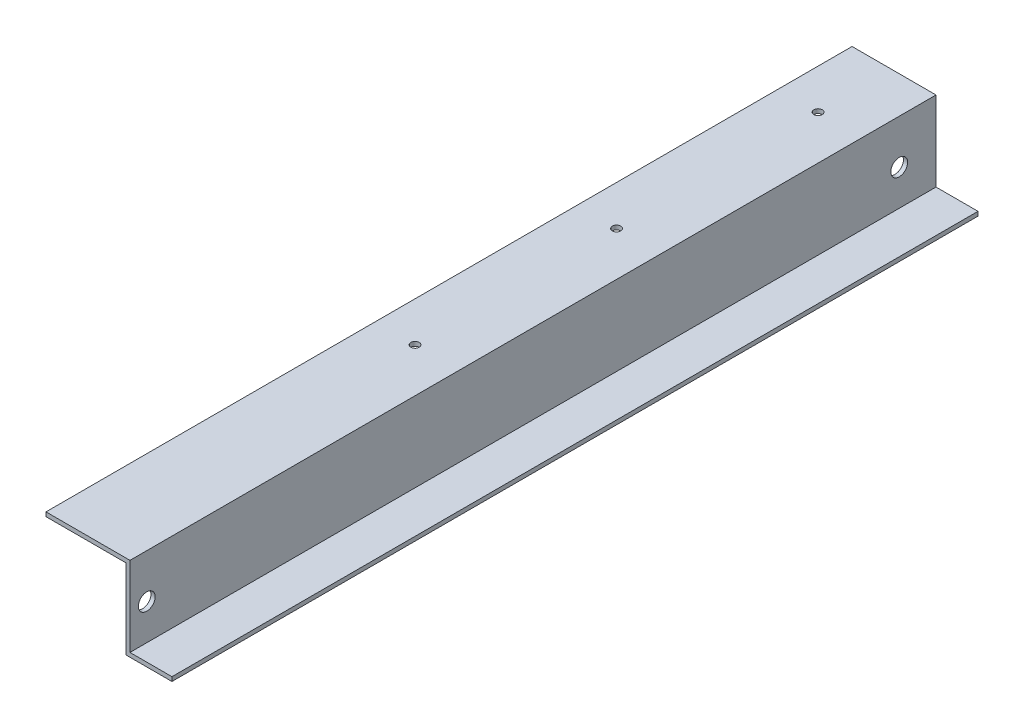
ISO-10303-21;
HEADER;
FILE_DESCRIPTION(('STEP AP214'),'2;1');
FILE_NAME('part.step','',(''),(''),'','','');
FILE_SCHEMA(('AUTOMOTIVE_DESIGN { 1 0 10303 214 1 1 1 1 }'));
ENDSEC;
DATA;
#1=APPLICATION_CONTEXT('core data for automotive mechanical design processes');
#2=APPLICATION_PROTOCOL_DEFINITION('international standard','automotive_design',2000,#1);
#3=PRODUCT_CONTEXT('',#1,'mechanical');
#4=PRODUCT('Part','Part','',(#3));
#5=PRODUCT_RELATED_PRODUCT_CATEGORY('part','',(#4));
#6=PRODUCT_DEFINITION_FORMATION('','',#4);
#7=PRODUCT_DEFINITION_CONTEXT('part definition',#1,'design');
#8=PRODUCT_DEFINITION('design','',#6,#7);
#9=PRODUCT_DEFINITION_SHAPE('','',#8);
#10=(LENGTH_UNIT() NAMED_UNIT(*) SI_UNIT(.MILLI.,.METRE.));
#11=(NAMED_UNIT(*) PLANE_ANGLE_UNIT() SI_UNIT($,.RADIAN.));
#12=(NAMED_UNIT(*) SI_UNIT($,.STERADIAN.) SOLID_ANGLE_UNIT());
#13=UNCERTAINTY_MEASURE_WITH_UNIT(LENGTH_MEASURE(1.E-05),#10,'distance_accuracy_value','');
#14=(GEOMETRIC_REPRESENTATION_CONTEXT(3) GLOBAL_UNCERTAINTY_ASSIGNED_CONTEXT((#13)) GLOBAL_UNIT_ASSIGNED_CONTEXT((#10,
#11,#12)) REPRESENTATION_CONTEXT('',''));
#15=CARTESIAN_POINT('',(0.,0.,0.));
#16=DIRECTION('',(0.,0.,1.));
#17=DIRECTION('',(1.,0.,0.));
#18=AXIS2_PLACEMENT_3D('',#15,#16,#17);
#19=CARTESIAN_POINT('',(0.79375,-14.2875,152.4));
#20=DIRECTION('',(0.,-1.,0.));
#21=DIRECTION('',(0.,0.,-1.));
#22=AXIS2_PLACEMENT_3D('',#19,#20,#21);
#23=PLANE('',#22);
#24=DIRECTION('',(0.,0.,-1.));
#25=VECTOR('',#24,1.);
#26=CARTESIAN_POINT('',(16.66875,-14.2875,152.4));
#27=LINE('',#26,#25);
#28=CARTESIAN_POINT('',(16.66875,-14.2875,152.4));
#29=VERTEX_POINT('',#28);
#30=CARTESIAN_POINT('',(16.66875,-14.2875,-152.4));
#31=VERTEX_POINT('',#30);
#32=EDGE_CURVE('E124',#29,#31,#27,.T.);
#33=ORIENTED_EDGE('',*,*,#32,.T.);
#34=DIRECTION('',(-1.,0.,0.));
#35=VECTOR('',#34,1.);
#36=CARTESIAN_POINT('',(0.79375,-14.2875,-152.4));
#37=LINE('',#36,#35);
#38=CARTESIAN_POINT('',(0.79375,-14.2875,-152.4));
#39=VERTEX_POINT('',#38);
#40=EDGE_CURVE('E118',#31,#39,#37,.T.);
#41=ORIENTED_EDGE('',*,*,#40,.T.);
#42=DIRECTION('',(0.,0.,-1.));
#43=VECTOR('',#42,1.);
#44=CARTESIAN_POINT('',(0.79375,-14.2875,152.4));
#45=LINE('',#44,#43);
#46=CARTESIAN_POINT('',(0.79375,-14.2875,152.4));
#47=VERTEX_POINT('',#46);
#48=EDGE_CURVE('E11',#47,#39,#45,.T.);
#49=ORIENTED_EDGE('',*,*,#48,.F.);
#50=DIRECTION('',(-1.,0.,0.));
#51=VECTOR('',#50,1.);
#52=CARTESIAN_POINT('',(0.79375,-14.2875,152.4));
#53=LINE('',#52,#51);
#54=EDGE_CURVE('E149',#29,#47,#53,.T.);
#55=ORIENTED_EDGE('',*,*,#54,.F.);
#56=EDGE_LOOP('',(#33,#41,#49,#55));
#57=FACE_BOUND('',#56,.T.);
#58=ADVANCED_FACE('F42',(#57),#23,.F.);
#59=CARTESIAN_POINT('',(0.79375,-14.2875,152.4));
#60=DIRECTION('',(-1.,0.,0.));
#61=DIRECTION('',(0.,0.,1.));
#62=AXIS2_PLACEMENT_3D('',#59,#60,#61);
#63=PLANE('',#62);
#64=CARTESIAN_POINT('',(0.79375,-0.793749999999999,-138.4808));
#65=DIRECTION('',(-1.,0.,0.));
#66=DIRECTION('',(0.,0.,1.));
#67=AXIS2_PLACEMENT_3D('',#64,#65,#66);
#68=CIRCLE('',#67,3.175);
#69=CARTESIAN_POINT('',(0.79375,-0.793749999999999,-135.3058));
#70=VERTEX_POINT('',#69);
#71=EDGE_CURVE('E236',#70,#70,#68,.T.);
#72=ORIENTED_EDGE('',*,*,#71,.T.);
#73=EDGE_LOOP('',(#72));
#74=FACE_BOUND('',#73,.T.);
#75=CARTESIAN_POINT('',(0.79375,-0.793749999999999,146.05));
#76=DIRECTION('',(-1.,0.,0.));
#77=DIRECTION('',(0.,0.,1.));
#78=AXIS2_PLACEMENT_3D('',#75,#76,#77);
#79=CIRCLE('',#78,3.175);
#80=CARTESIAN_POINT('',(0.79375,-0.793749999999999,149.225));
#81=VERTEX_POINT('',#80);
#82=EDGE_CURVE('E234',#81,#81,#79,.T.);
#83=ORIENTED_EDGE('',*,*,#82,.T.);
#84=EDGE_LOOP('',(#83));
#85=FACE_BOUND('',#84,.T.);
#86=ORIENTED_EDGE('',*,*,#48,.T.);
#87=DIRECTION('',(0.,1.,0.));
#88=VECTOR('',#87,1.);
#89=CARTESIAN_POINT('',(0.79375,-14.2875,-152.4));
#90=LINE('',#89,#88);
#91=CARTESIAN_POINT('',(0.79375,15.875,-152.4));
#92=VERTEX_POINT('',#91);
#93=EDGE_CURVE('E108',#39,#92,#90,.T.);
#94=ORIENTED_EDGE('',*,*,#93,.T.);
#95=DIRECTION('',(0.,0.,-1.));
#96=VECTOR('',#95,1.);
#97=CARTESIAN_POINT('',(0.79375,15.875,152.4));
#98=LINE('',#97,#96);
#99=CARTESIAN_POINT('',(0.79375,15.875,152.4));
#100=VERTEX_POINT('',#99);
#101=EDGE_CURVE('E49',#100,#92,#98,.T.);
#102=ORIENTED_EDGE('',*,*,#101,.F.);
#103=DIRECTION('',(0.,1.,0.));
#104=VECTOR('',#103,1.);
#105=CARTESIAN_POINT('',(0.79375,-14.2875,152.4));
#106=LINE('',#105,#104);
#107=EDGE_CURVE('E109',#47,#100,#106,.T.);
#108=ORIENTED_EDGE('',*,*,#107,.F.);
#109=EDGE_LOOP('',(#86,#94,#102,#108));
#110=FACE_BOUND('',#109,.T.);
#111=ADVANCED_FACE('F106',(#74,#85,#110),#63,.F.);
#112=CARTESIAN_POINT('',(0.79375,15.875,152.4));
#113=DIRECTION('',(0.,-1.,0.));
#114=DIRECTION('',(0.,0.,-1.));
#115=AXIS2_PLACEMENT_3D('',#112,#113,#114);
#116=PLANE('',#115);
#117=CARTESIAN_POINT('',(-15.875,15.875,-124.46));
#118=DIRECTION('',(0.,-1.,0.));
#119=DIRECTION('',(0.,0.,-1.));
#120=AXIS2_PLACEMENT_3D('',#117,#118,#119);
#121=CIRCLE('',#120,1.5875);
#122=CARTESIAN_POINT('',(-15.875,15.875,-126.0475));
#123=VERTEX_POINT('',#122);
#124=EDGE_CURVE('E125',#123,#123,#121,.T.);
#125=ORIENTED_EDGE('',*,*,#124,.T.);
#126=EDGE_LOOP('',(#125));
#127=FACE_BOUND('',#126,.T.);
#128=CARTESIAN_POINT('',(-15.875,15.875,-48.2599999999999));
#129=DIRECTION('',(0.,-1.,0.));
#130=DIRECTION('',(0.,0.,-1.));
#131=AXIS2_PLACEMENT_3D('',#128,#129,#130);
#132=CIRCLE('',#131,1.5875);
#133=CARTESIAN_POINT('',(-15.875,15.875,-49.8474999999999));
#134=VERTEX_POINT('',#133);
#135=EDGE_CURVE('E247',#134,#134,#132,.T.);
#136=ORIENTED_EDGE('',*,*,#135,.T.);
#137=EDGE_LOOP('',(#136));
#138=FACE_BOUND('',#137,.T.);
#139=CARTESIAN_POINT('',(-15.875,15.875,27.9400000000001));
#140=DIRECTION('',(0.,-1.,0.));
#141=DIRECTION('',(0.,0.,-1.));
#142=AXIS2_PLACEMENT_3D('',#139,#140,#141);
#143=CIRCLE('',#142,1.5875);
#144=CARTESIAN_POINT('',(-15.875,15.875,26.3525000000001));
#145=VERTEX_POINT('',#144);
#146=EDGE_CURVE('E131',#145,#145,#143,.T.);
#147=ORIENTED_EDGE('',*,*,#146,.T.);
#148=EDGE_LOOP('',(#147));
#149=FACE_BOUND('',#148,.T.);
#150=ORIENTED_EDGE('',*,*,#101,.T.);
#151=DIRECTION('',(-1.,0.,0.));
#152=VECTOR('',#151,1.);
#153=CARTESIAN_POINT('',(0.79375,15.875,-152.4));
#154=LINE('',#153,#152);
#155=CARTESIAN_POINT('',(-30.95625,15.875,-152.4));
#156=VERTEX_POINT('',#155);
#157=EDGE_CURVE('E122',#92,#156,#154,.T.);
#158=ORIENTED_EDGE('',*,*,#157,.T.);
#159=DIRECTION('',(0.,0.,-1.));
#160=VECTOR('',#159,1.);
#161=CARTESIAN_POINT('',(-30.95625,15.875,152.4));
#162=LINE('',#161,#160);
#163=CARTESIAN_POINT('',(-30.95625,15.875,152.4));
#164=VERTEX_POINT('',#163);
#165=EDGE_CURVE('E171',#164,#156,#162,.T.);
#166=ORIENTED_EDGE('',*,*,#165,.F.);
#167=DIRECTION('',(-1.,0.,0.));
#168=VECTOR('',#167,1.);
#169=CARTESIAN_POINT('',(0.79375,15.875,152.4));
#170=LINE('',#169,#168);
#171=EDGE_CURVE('E152',#100,#164,#170,.T.);
#172=ORIENTED_EDGE('',*,*,#171,.F.);
#173=EDGE_LOOP('',(#150,#158,#166,#172));
#174=FACE_BOUND('',#173,.T.);
#175=ADVANCED_FACE('F174',(#127,#138,#149,#174),#116,.F.);
#176=CARTESIAN_POINT('',(-30.95625,15.875,152.4));
#177=DIRECTION('',(1.,0.,0.));
#178=DIRECTION('',(0.,0.,-1.));
#179=AXIS2_PLACEMENT_3D('',#176,#177,#178);
#180=PLANE('',#179);
#181=ORIENTED_EDGE('',*,*,#165,.T.);
#182=DIRECTION('',(0.,-1.,0.));
#183=VECTOR('',#182,1.);
#184=CARTESIAN_POINT('',(-30.95625,15.875,-152.4));
#185=LINE('',#184,#183);
#186=CARTESIAN_POINT('',(-30.95625,14.2875,-152.4));
#187=VERTEX_POINT('',#186);
#188=EDGE_CURVE('E135',#156,#187,#185,.T.);
#189=ORIENTED_EDGE('',*,*,#188,.T.);
#190=DIRECTION('',(0.,0.,-1.));
#191=VECTOR('',#190,1.);
#192=CARTESIAN_POINT('',(-30.95625,14.2875,152.4));
#193=LINE('',#192,#191);
#194=CARTESIAN_POINT('',(-30.95625,14.2875,152.4));
#195=VERTEX_POINT('',#194);
#196=EDGE_CURVE('E169',#195,#187,#193,.T.);
#197=ORIENTED_EDGE('',*,*,#196,.F.);
#198=DIRECTION('',(0.,-1.,0.));
#199=VECTOR('',#198,1.);
#200=CARTESIAN_POINT('',(-30.95625,15.875,152.4));
#201=LINE('',#200,#199);
#202=EDGE_CURVE('E154',#164,#195,#201,.T.);
#203=ORIENTED_EDGE('',*,*,#202,.F.);
#204=EDGE_LOOP('',(#181,#189,#197,#203));
#205=FACE_BOUND('',#204,.T.);
#206=ADVANCED_FACE('F182',(#205),#180,.F.);
#207=CARTESIAN_POINT('',(-0.79375,14.2875,152.4));
#208=DIRECTION('',(0.,1.,0.));
#209=DIRECTION('',(0.,0.,1.));
#210=AXIS2_PLACEMENT_3D('',#207,#208,#209);
#211=PLANE('',#210);
#212=CARTESIAN_POINT('',(-15.875,14.2875,-124.46));
#213=DIRECTION('',(0.,-1.,0.));
#214=DIRECTION('',(0.,0.,-1.));
#215=AXIS2_PLACEMENT_3D('',#212,#213,#214);
#216=CIRCLE('',#215,1.5875);
#217=CARTESIAN_POINT('',(-15.875,14.2875,-126.0475));
#218=VERTEX_POINT('',#217);
#219=EDGE_CURVE('E128',#218,#218,#216,.T.);
#220=ORIENTED_EDGE('',*,*,#219,.F.);
#221=EDGE_LOOP('',(#220));
#222=FACE_BOUND('',#221,.T.);
#223=CARTESIAN_POINT('',(-15.875,14.2875,-48.2599999999999));
#224=DIRECTION('',(0.,-1.,0.));
#225=DIRECTION('',(0.,0.,-1.));
#226=AXIS2_PLACEMENT_3D('',#223,#224,#225);
#227=CIRCLE('',#226,1.5875);
#228=CARTESIAN_POINT('',(-15.875,14.2875,-49.8474999999999));
#229=VERTEX_POINT('',#228);
#230=EDGE_CURVE('E244',#229,#229,#227,.T.);
#231=ORIENTED_EDGE('',*,*,#230,.F.);
#232=EDGE_LOOP('',(#231));
#233=FACE_BOUND('',#232,.T.);
#234=CARTESIAN_POINT('',(-15.875,14.2875,27.9400000000001));
#235=DIRECTION('',(0.,-1.,0.));
#236=DIRECTION('',(0.,0.,-1.));
#237=AXIS2_PLACEMENT_3D('',#234,#235,#236);
#238=CIRCLE('',#237,1.5875);
#239=CARTESIAN_POINT('',(-15.875,14.2875,26.3525000000001));
#240=VERTEX_POINT('',#239);
#241=EDGE_CURVE('E249',#240,#240,#238,.T.);
#242=ORIENTED_EDGE('',*,*,#241,.F.);
#243=EDGE_LOOP('',(#242));
#244=FACE_BOUND('',#243,.T.);
#245=ORIENTED_EDGE('',*,*,#196,.T.);
#246=DIRECTION('',(1.,0.,0.));
#247=VECTOR('',#246,1.);
#248=CARTESIAN_POINT('',(-0.79375,14.2875,-152.4));
#249=LINE('',#248,#247);
#250=CARTESIAN_POINT('',(-0.79375,14.2875,-152.4));
#251=VERTEX_POINT('',#250);
#252=EDGE_CURVE('E138',#187,#251,#249,.T.);
#253=ORIENTED_EDGE('',*,*,#252,.T.);
#254=DIRECTION('',(0.,0.,-1.));
#255=VECTOR('',#254,1.);
#256=CARTESIAN_POINT('',(-0.79375,14.2875,152.4));
#257=LINE('',#256,#255);
#258=CARTESIAN_POINT('',(-0.79375,14.2875,152.4));
#259=VERTEX_POINT('',#258);
#260=EDGE_CURVE('E167',#259,#251,#257,.T.);
#261=ORIENTED_EDGE('',*,*,#260,.F.);
#262=DIRECTION('',(1.,0.,0.));
#263=VECTOR('',#262,1.);
#264=CARTESIAN_POINT('',(-0.79375,14.2875,152.4));
#265=LINE('',#264,#263);
#266=EDGE_CURVE('E156',#195,#259,#265,.T.);
#267=ORIENTED_EDGE('',*,*,#266,.F.);
#268=EDGE_LOOP('',(#245,#253,#261,#267));
#269=FACE_BOUND('',#268,.T.);
#270=ADVANCED_FACE('F185',(#222,#233,#244,#269),#211,.F.);
#271=CARTESIAN_POINT('',(-0.79375,-15.875,152.4));
#272=DIRECTION('',(1.,0.,0.));
#273=DIRECTION('',(0.,0.,-1.));
#274=AXIS2_PLACEMENT_3D('',#271,#272,#273);
#275=PLANE('',#274);
#276=CARTESIAN_POINT('',(-0.79375,-0.793749999999999,-138.4808));
#277=DIRECTION('',(-1.,0.,0.));
#278=DIRECTION('',(0.,0.,1.));
#279=AXIS2_PLACEMENT_3D('',#276,#277,#278);
#280=CIRCLE('',#279,3.175);
#281=CARTESIAN_POINT('',(-0.79375,-0.793749999999999,-135.3058));
#282=VERTEX_POINT('',#281);
#283=EDGE_CURVE('E229',#282,#282,#280,.T.);
#284=ORIENTED_EDGE('',*,*,#283,.F.);
#285=EDGE_LOOP('',(#284));
#286=FACE_BOUND('',#285,.T.);
#287=CARTESIAN_POINT('',(-0.79375,-0.793749999999999,146.05));
#288=DIRECTION('',(-1.,0.,0.));
#289=DIRECTION('',(0.,0.,1.));
#290=AXIS2_PLACEMENT_3D('',#287,#288,#289);
#291=CIRCLE('',#290,3.175);
#292=CARTESIAN_POINT('',(-0.79375,-0.793749999999999,149.225));
#293=VERTEX_POINT('',#292);
#294=EDGE_CURVE('E232',#293,#293,#291,.T.);
#295=ORIENTED_EDGE('',*,*,#294,.F.);
#296=EDGE_LOOP('',(#295));
#297=FACE_BOUND('',#296,.T.);
#298=ORIENTED_EDGE('',*,*,#260,.T.);
#299=DIRECTION('',(0.,-1.,0.));
#300=VECTOR('',#299,1.);
#301=CARTESIAN_POINT('',(-0.79375,-15.875,-152.4));
#302=LINE('',#301,#300);
#303=CARTESIAN_POINT('',(-0.79375,-15.875,-152.4));
#304=VERTEX_POINT('',#303);
#305=EDGE_CURVE('E141',#251,#304,#302,.T.);
#306=ORIENTED_EDGE('',*,*,#305,.T.);
#307=DIRECTION('',(0.,0.,-1.));
#308=VECTOR('',#307,1.);
#309=CARTESIAN_POINT('',(-0.79375,-15.875,152.4));
#310=LINE('',#309,#308);
#311=CARTESIAN_POINT('',(-0.79375,-15.875,152.4));
#312=VERTEX_POINT('',#311);
#313=EDGE_CURVE('E165',#312,#304,#310,.T.);
#314=ORIENTED_EDGE('',*,*,#313,.F.);
#315=DIRECTION('',(0.,-1.,0.));
#316=VECTOR('',#315,1.);
#317=CARTESIAN_POINT('',(-0.79375,-15.875,152.4));
#318=LINE('',#317,#316);
#319=EDGE_CURVE('E158',#259,#312,#318,.T.);
#320=ORIENTED_EDGE('',*,*,#319,.F.);
#321=EDGE_LOOP('',(#298,#306,#314,#320));
#322=FACE_BOUND('',#321,.T.);
#323=ADVANCED_FACE('F190',(#286,#297,#322),#275,.F.);
#324=CARTESIAN_POINT('',(-0.79375,-15.875,152.4));
#325=DIRECTION('',(0.,1.,0.));
#326=DIRECTION('',(0.,0.,1.));
#327=AXIS2_PLACEMENT_3D('',#324,#325,#326);
#328=PLANE('',#327);
#329=ORIENTED_EDGE('',*,*,#313,.T.);
#330=DIRECTION('',(1.,0.,0.));
#331=VECTOR('',#330,1.);
#332=CARTESIAN_POINT('',(-0.79375,-15.875,-152.4));
#333=LINE('',#332,#331);
#334=CARTESIAN_POINT('',(16.66875,-15.875,-152.4));
#335=VERTEX_POINT('',#334);
#336=EDGE_CURVE('E144',#304,#335,#333,.T.);
#337=ORIENTED_EDGE('',*,*,#336,.T.);
#338=DIRECTION('',(0.,0.,-1.));
#339=VECTOR('',#338,1.);
#340=CARTESIAN_POINT('',(16.66875,-15.875,152.4));
#341=LINE('',#340,#339);
#342=CARTESIAN_POINT('',(16.66875,-15.875,152.4));
#343=VERTEX_POINT('',#342);
#344=EDGE_CURVE('E163',#343,#335,#341,.T.);
#345=ORIENTED_EDGE('',*,*,#344,.F.);
#346=DIRECTION('',(1.,0.,0.));
#347=VECTOR('',#346,1.);
#348=CARTESIAN_POINT('',(-0.79375,-15.875,152.4));
#349=LINE('',#348,#347);
#350=EDGE_CURVE('E61',#312,#343,#349,.T.);
#351=ORIENTED_EDGE('',*,*,#350,.F.);
#352=EDGE_LOOP('',(#329,#337,#345,#351));
#353=FACE_BOUND('',#352,.T.);
#354=ADVANCED_FACE('F193',(#353),#328,.F.);
#355=CARTESIAN_POINT('',(16.66875,-14.2875,152.4));
#356=DIRECTION('',(-1.,0.,0.));
#357=DIRECTION('',(0.,0.,1.));
#358=AXIS2_PLACEMENT_3D('',#355,#356,#357);
#359=PLANE('',#358);
#360=ORIENTED_EDGE('',*,*,#344,.T.);
#361=DIRECTION('',(0.,1.,0.));
#362=VECTOR('',#361,1.);
#363=CARTESIAN_POINT('',(16.66875,-14.2875,-152.4));
#364=LINE('',#363,#362);
#365=EDGE_CURVE('E147',#335,#31,#364,.T.);
#366=ORIENTED_EDGE('',*,*,#365,.T.);
#367=ORIENTED_EDGE('',*,*,#32,.F.);
#368=DIRECTION('',(0.,1.,0.));
#369=VECTOR('',#368,1.);
#370=CARTESIAN_POINT('',(16.66875,-14.2875,152.4));
#371=LINE('',#370,#369);
#372=EDGE_CURVE('E56',#343,#29,#371,.T.);
#373=ORIENTED_EDGE('',*,*,#372,.F.);
#374=EDGE_LOOP('',(#360,#366,#367,#373));
#375=FACE_BOUND('',#374,.T.);
#376=ADVANCED_FACE('F195',(#375),#359,.F.);
#377=CARTESIAN_POINT('',(0.,0.,152.4));
#378=DIRECTION('',(0.,0.,-1.));
#379=DIRECTION('',(-1.,0.,0.));
#380=AXIS2_PLACEMENT_3D('',#377,#378,#379);
#381=PLANE('',#380);
#382=ORIENTED_EDGE('',*,*,#54,.T.);
#383=ORIENTED_EDGE('',*,*,#107,.T.);
#384=ORIENTED_EDGE('',*,*,#171,.T.);
#385=ORIENTED_EDGE('',*,*,#202,.T.);
#386=ORIENTED_EDGE('',*,*,#266,.T.);
#387=ORIENTED_EDGE('',*,*,#319,.T.);
#388=ORIENTED_EDGE('',*,*,#350,.T.);
#389=ORIENTED_EDGE('',*,*,#372,.T.);
#390=EDGE_LOOP('',(#382,#383,#384,#385,#386,#387,#388,#389));
#391=FACE_BOUND('',#390,.T.);
#392=ADVANCED_FACE('F177',(#391),#381,.F.);
#393=CARTESIAN_POINT('',(0.,0.,-152.4));
#394=DIRECTION('',(0.,0.,-1.));
#395=DIRECTION('',(-1.,0.,0.));
#396=AXIS2_PLACEMENT_3D('',#393,#394,#395);
#397=PLANE('',#396);
#398=ORIENTED_EDGE('',*,*,#40,.F.);
#399=ORIENTED_EDGE('',*,*,#365,.F.);
#400=ORIENTED_EDGE('',*,*,#336,.F.);
#401=ORIENTED_EDGE('',*,*,#305,.F.);
#402=ORIENTED_EDGE('',*,*,#252,.F.);
#403=ORIENTED_EDGE('',*,*,#188,.F.);
#404=ORIENTED_EDGE('',*,*,#157,.F.);
#405=ORIENTED_EDGE('',*,*,#93,.F.);
#406=EDGE_LOOP('',(#398,#399,#400,#401,#402,#403,#404,#405));
#407=FACE_BOUND('',#406,.T.);
#408=ADVANCED_FACE('F116',(#407),#397,.T.);
#409=CARTESIAN_POINT('',(-15.875,15.875,27.9400000000001));
#410=DIRECTION('',(0.,-1.,0.));
#411=DIRECTION('',(0.,0.,-1.));
#412=AXIS2_PLACEMENT_3D('',#409,#410,#411);
#413=CYLINDRICAL_SURFACE('',#412,1.5875);
#414=ORIENTED_EDGE('',*,*,#146,.F.);
#415=EDGE_LOOP('',(#414));
#416=FACE_BOUND('',#415,.T.);
#417=ORIENTED_EDGE('',*,*,#241,.T.);
#418=EDGE_LOOP('',(#417));
#419=FACE_BOUND('',#418,.T.);
#420=ADVANCED_FACE('F276',(#416,#419),#413,.F.);
#421=CARTESIAN_POINT('',(-15.875,15.875,-48.2599999999999));
#422=DIRECTION('',(0.,-1.,0.));
#423=DIRECTION('',(0.,0.,-1.));
#424=AXIS2_PLACEMENT_3D('',#421,#422,#423);
#425=CYLINDRICAL_SURFACE('',#424,1.5875);
#426=ORIENTED_EDGE('',*,*,#135,.F.);
#427=EDGE_LOOP('',(#426));
#428=FACE_BOUND('',#427,.T.);
#429=ORIENTED_EDGE('',*,*,#230,.T.);
#430=EDGE_LOOP('',(#429));
#431=FACE_BOUND('',#430,.T.);
#432=ADVANCED_FACE('F272',(#428,#431),#425,.F.);
#433=CARTESIAN_POINT('',(-15.875,15.875,-124.46));
#434=DIRECTION('',(0.,-1.,0.));
#435=DIRECTION('',(0.,0.,-1.));
#436=AXIS2_PLACEMENT_3D('',#433,#434,#435);
#437=CYLINDRICAL_SURFACE('',#436,1.5875);
#438=ORIENTED_EDGE('',*,*,#124,.F.);
#439=EDGE_LOOP('',(#438));
#440=FACE_BOUND('',#439,.T.);
#441=ORIENTED_EDGE('',*,*,#219,.T.);
#442=EDGE_LOOP('',(#441));
#443=FACE_BOUND('',#442,.T.);
#444=ADVANCED_FACE('F266',(#440,#443),#437,.F.);
#445=CARTESIAN_POINT('',(0.79375,-0.793749999999999,146.05));
#446=DIRECTION('',(-1.,0.,0.));
#447=DIRECTION('',(0.,0.,1.));
#448=AXIS2_PLACEMENT_3D('',#445,#446,#447);
#449=CYLINDRICAL_SURFACE('',#448,3.175);
#450=ORIENTED_EDGE('',*,*,#82,.F.);
#451=EDGE_LOOP('',(#450));
#452=FACE_BOUND('',#451,.T.);
#453=ORIENTED_EDGE('',*,*,#294,.T.);
#454=EDGE_LOOP('',(#453));
#455=FACE_BOUND('',#454,.T.);
#456=ADVANCED_FACE('F261',(#452,#455),#449,.F.);
#457=CARTESIAN_POINT('',(0.79375,-0.793749999999999,-138.4808));
#458=DIRECTION('',(-1.,0.,0.));
#459=DIRECTION('',(0.,0.,1.));
#460=AXIS2_PLACEMENT_3D('',#457,#458,#459);
#461=CYLINDRICAL_SURFACE('',#460,3.175);
#462=ORIENTED_EDGE('',*,*,#71,.F.);
#463=EDGE_LOOP('',(#462));
#464=FACE_BOUND('',#463,.T.);
#465=ORIENTED_EDGE('',*,*,#283,.T.);
#466=EDGE_LOOP('',(#465));
#467=FACE_BOUND('',#466,.T.);
#468=ADVANCED_FACE('F258',(#464,#467),#461,.F.);
#469=CLOSED_SHELL('',(#58,#111,#175,#206,#270,#323,#354,#376,#392,#408,#420,#432,#444,#456,#468));
#470=MANIFOLD_SOLID_BREP('B2',#469);
#471=ADVANCED_BREP_SHAPE_REPRESENTATION('',(#18,#470),#14);
#472=SHAPE_DEFINITION_REPRESENTATION(#9,#471);
ENDSEC;
END-ISO-10303-21;
